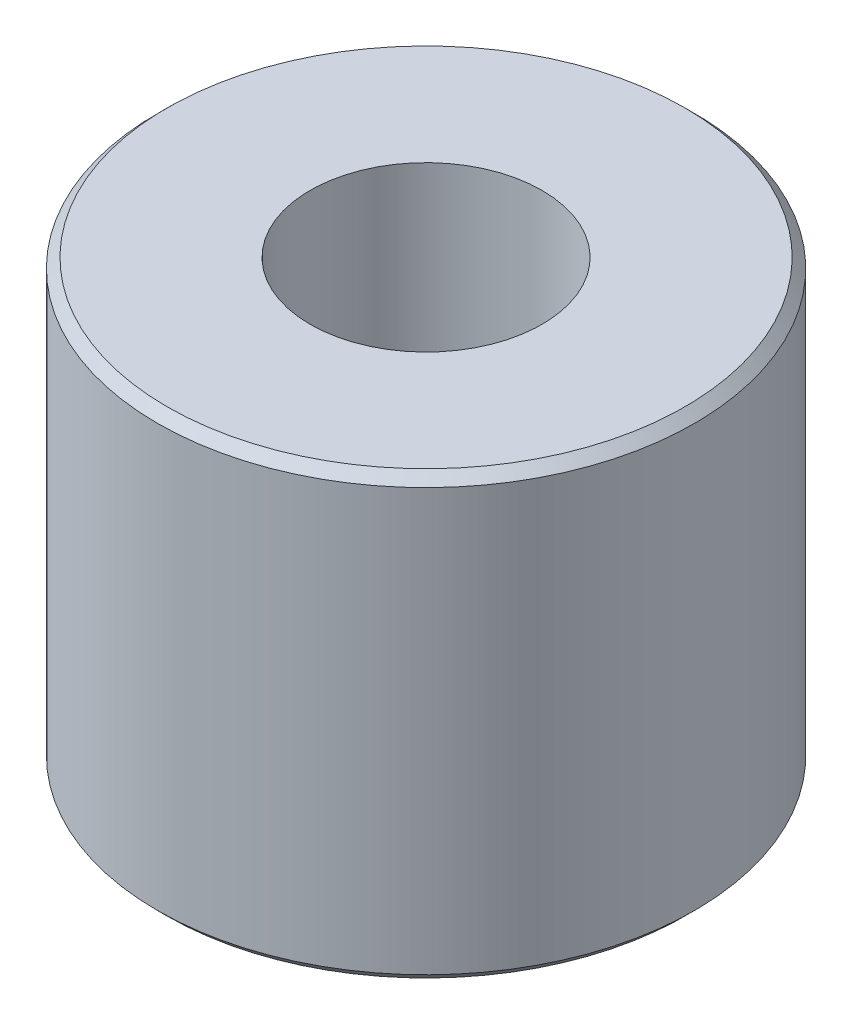
ISO-10303-21;
HEADER;
FILE_DESCRIPTION(('STEP AP214'),'2;1');
FILE_NAME('part.step','',(''),(''),'','','');
FILE_SCHEMA(('AUTOMOTIVE_DESIGN { 1 0 10303 214 1 1 1 1 }'));
ENDSEC;
DATA;
#1=APPLICATION_CONTEXT('core data for automotive mechanical design processes');
#2=APPLICATION_PROTOCOL_DEFINITION('international standard','automotive_design',2000,#1);
#3=PRODUCT_CONTEXT('',#1,'mechanical');
#4=PRODUCT('Part','Part','',(#3));
#5=PRODUCT_RELATED_PRODUCT_CATEGORY('part','',(#4));
#6=PRODUCT_DEFINITION_FORMATION('','',#4);
#7=PRODUCT_DEFINITION_CONTEXT('part definition',#1,'design');
#8=PRODUCT_DEFINITION('design','',#6,#7);
#9=PRODUCT_DEFINITION_SHAPE('','',#8);
#10=(LENGTH_UNIT() NAMED_UNIT(*) SI_UNIT(.MILLI.,.METRE.));
#11=(NAMED_UNIT(*) PLANE_ANGLE_UNIT() SI_UNIT($,.RADIAN.));
#12=(NAMED_UNIT(*) SI_UNIT($,.STERADIAN.) SOLID_ANGLE_UNIT());
#13=UNCERTAINTY_MEASURE_WITH_UNIT(LENGTH_MEASURE(1.E-05),#10,'distance_accuracy_value','');
#14=(GEOMETRIC_REPRESENTATION_CONTEXT(3) GLOBAL_UNCERTAINTY_ASSIGNED_CONTEXT((#13)) GLOBAL_UNIT_ASSIGNED_CONTEXT((#10,
#11,#12)) REPRESENTATION_CONTEXT('',''));
#15=CARTESIAN_POINT('',(0.,0.,0.));
#16=DIRECTION('',(0.,0.,1.));
#17=DIRECTION('',(1.,0.,0.));
#18=AXIS2_PLACEMENT_3D('',#15,#16,#17);
#19=CARTESIAN_POINT('',(0.,23.,0.));
#20=DIRECTION('',(0.,-1.,0.));
#21=DIRECTION('',(0.,0.,-1.));
#22=AXIS2_PLACEMENT_3D('',#19,#20,#21);
#23=CYLINDRICAL_SURFACE('',#22,14.);
#24=CARTESIAN_POINT('',(0.,0.500000000000007,0.));
#25=DIRECTION('',(0.,1.,0.));
#26=DIRECTION('',(0.,0.,1.));
#27=AXIS2_PLACEMENT_3D('',#24,#25,#26);
#28=CIRCLE('',#27,14.);
#29=CARTESIAN_POINT('',(0.,0.500000000000007,14.));
#30=VERTEX_POINT('',#29);
#31=EDGE_CURVE('E51',#30,#30,#28,.T.);
#32=ORIENTED_EDGE('',*,*,#31,.T.);
#33=EDGE_LOOP('',(#32));
#34=FACE_BOUND('',#33,.T.);
#35=CARTESIAN_POINT('',(0.,22.5,0.));
#36=DIRECTION('',(0.,1.,0.));
#37=DIRECTION('',(0.,0.,1.));
#38=AXIS2_PLACEMENT_3D('',#35,#36,#37);
#39=CIRCLE('',#38,14.);
#40=CARTESIAN_POINT('',(0.,22.5,14.));
#41=VERTEX_POINT('',#40);
#42=EDGE_CURVE('E54',#41,#41,#39,.F.);
#43=ORIENTED_EDGE('',*,*,#42,.T.);
#44=EDGE_LOOP('',(#43));
#45=FACE_BOUND('',#44,.T.);
#46=ADVANCED_FACE('F39',(#34,#45),#23,.T.);
#47=CARTESIAN_POINT('',(0.,23.,0.));
#48=DIRECTION('',(0.,1.,0.));
#49=DIRECTION('',(0.,0.,1.));
#50=AXIS2_PLACEMENT_3D('',#47,#48,#49);
#51=PLANE('',#50);
#52=CARTESIAN_POINT('',(0.,23.,0.));
#53=DIRECTION('',(0.,1.,0.));
#54=DIRECTION('',(0.,0.,1.));
#55=AXIS2_PLACEMENT_3D('',#52,#53,#54);
#56=CIRCLE('',#55,13.5);
#57=CARTESIAN_POINT('',(0.,23.,13.5));
#58=VERTEX_POINT('',#57);
#59=EDGE_CURVE('E10',#58,#58,#56,.T.);
#60=ORIENTED_EDGE('',*,*,#59,.T.);
#61=EDGE_LOOP('',(#60));
#62=FACE_BOUND('',#61,.T.);
#63=CARTESIAN_POINT('',(0.,23.,0.));
#64=DIRECTION('',(0.,1.,0.));
#65=DIRECTION('',(0.,0.,1.));
#66=AXIS2_PLACEMENT_3D('',#63,#64,#65);
#67=CIRCLE('',#66,6.05);
#68=CARTESIAN_POINT('',(0.,23.,6.05));
#69=VERTEX_POINT('',#68);
#70=EDGE_CURVE('E62',#69,#69,#67,.T.);
#71=ORIENTED_EDGE('',*,*,#70,.F.);
#72=EDGE_LOOP('',(#71));
#73=FACE_BOUND('',#72,.T.);
#74=ADVANCED_FACE('F77',(#62,#73),#51,.T.);
#75=CARTESIAN_POINT('',(0.,0.,0.));
#76=DIRECTION('',(0.,1.,0.));
#77=DIRECTION('',(0.,0.,1.));
#78=AXIS2_PLACEMENT_3D('',#75,#76,#77);
#79=PLANE('',#78);
#80=CARTESIAN_POINT('',(0.,0.,0.));
#81=DIRECTION('',(0.,1.,0.));
#82=DIRECTION('',(0.,0.,1.));
#83=AXIS2_PLACEMENT_3D('',#80,#81,#82);
#84=CIRCLE('',#83,13.5);
#85=CARTESIAN_POINT('',(0.,0.,13.5));
#86=VERTEX_POINT('',#85);
#87=EDGE_CURVE('E50',#86,#86,#84,.F.);
#88=ORIENTED_EDGE('',*,*,#87,.T.);
#89=EDGE_LOOP('',(#88));
#90=FACE_BOUND('',#89,.T.);
#91=CARTESIAN_POINT('',(0.,0.,0.));
#92=DIRECTION('',(0.,1.,0.));
#93=DIRECTION('',(0.,0.,1.));
#94=AXIS2_PLACEMENT_3D('',#91,#92,#93);
#95=CIRCLE('',#94,6.05);
#96=CARTESIAN_POINT('',(0.,0.,6.05));
#97=VERTEX_POINT('',#96);
#98=EDGE_CURVE('E58',#97,#97,#95,.T.);
#99=ORIENTED_EDGE('',*,*,#98,.T.);
#100=EDGE_LOOP('',(#99));
#101=FACE_BOUND('',#100,.T.);
#102=ADVANCED_FACE('F69',(#90,#101),#79,.F.);
#103=CARTESIAN_POINT('',(0.,0.,0.));
#104=DIRECTION('',(0.,1.,0.));
#105=DIRECTION('',(0.,0.,1.));
#106=AXIS2_PLACEMENT_3D('',#103,#104,#105);
#107=CYLINDRICAL_SURFACE('',#106,6.05);
#108=ORIENTED_EDGE('',*,*,#98,.F.);
#109=EDGE_LOOP('',(#108));
#110=FACE_BOUND('',#109,.T.);
#111=ORIENTED_EDGE('',*,*,#70,.T.);
#112=EDGE_LOOP('',(#111));
#113=FACE_BOUND('',#112,.T.);
#114=ADVANCED_FACE('F70',(#110,#113),#107,.F.);
#115=CARTESIAN_POINT('',(0.,0.500000000000007,0.));
#116=DIRECTION('',(0.,1.,0.));
#117=DIRECTION('',(0.,0.,1.));
#118=AXIS2_PLACEMENT_3D('',#115,#116,#117);
#119=CONICAL_SURFACE('',#118,14.,0.78539816339745);
#120=ORIENTED_EDGE('',*,*,#87,.F.);
#121=EDGE_LOOP('',(#120));
#122=FACE_BOUND('',#121,.T.);
#123=ORIENTED_EDGE('',*,*,#31,.F.);
#124=EDGE_LOOP('',(#123));
#125=FACE_BOUND('',#124,.T.);
#126=ADVANCED_FACE('F75',(#122,#125),#119,.T.);
#127=CARTESIAN_POINT('',(0.,23.,0.));
#128=DIRECTION('',(0.,-1.,0.));
#129=DIRECTION('',(0.,0.,-1.));
#130=AXIS2_PLACEMENT_3D('',#127,#128,#129);
#131=CONICAL_SURFACE('',#130,13.5,0.78539816339745);
#132=ORIENTED_EDGE('',*,*,#42,.F.);
#133=EDGE_LOOP('',(#132));
#134=FACE_BOUND('',#133,.T.);
#135=ORIENTED_EDGE('',*,*,#59,.F.);
#136=EDGE_LOOP('',(#135));
#137=FACE_BOUND('',#136,.T.);
#138=ADVANCED_FACE('F45',(#134,#137),#131,.T.);
#139=CLOSED_SHELL('',(#46,#74,#102,#114,#126,#138));
#140=MANIFOLD_SOLID_BREP('B2',#139);
#141=ADVANCED_BREP_SHAPE_REPRESENTATION('',(#18,#140),#14);
#142=SHAPE_DEFINITION_REPRESENTATION(#9,#141);
ENDSEC;
END-ISO-10303-21;
